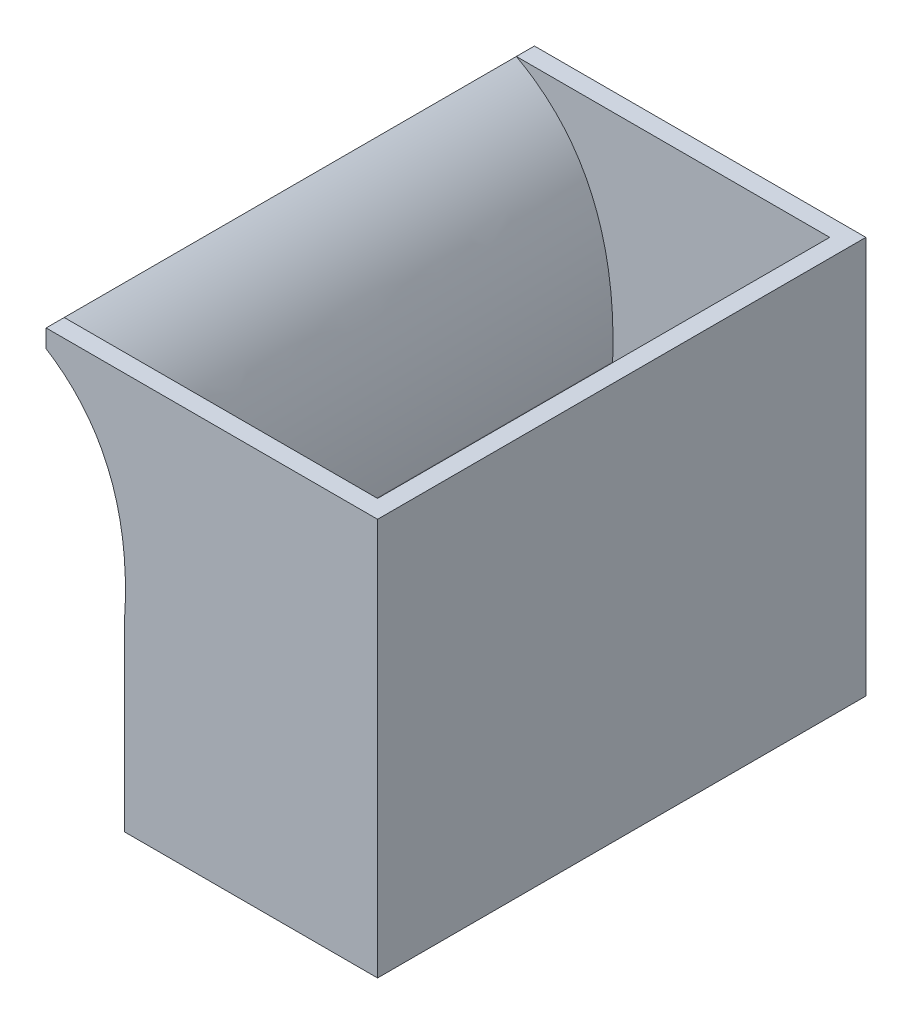
ISO-10303-21;
HEADER;
FILE_DESCRIPTION(('STEP AP214'),'2;1');
FILE_NAME('part.step','',(''),(''),'','','');
FILE_SCHEMA(('AUTOMOTIVE_DESIGN { 1 0 10303 214 1 1 1 1 }'));
ENDSEC;
DATA;
#1=APPLICATION_CONTEXT('core data for automotive mechanical design processes');
#2=APPLICATION_PROTOCOL_DEFINITION('international standard','automotive_design',2000,#1);
#3=PRODUCT_CONTEXT('',#1,'mechanical');
#4=PRODUCT('Part','Part','',(#3));
#5=PRODUCT_RELATED_PRODUCT_CATEGORY('part','',(#4));
#6=PRODUCT_DEFINITION_FORMATION('','',#4);
#7=PRODUCT_DEFINITION_CONTEXT('part definition',#1,'design');
#8=PRODUCT_DEFINITION('design','',#6,#7);
#9=PRODUCT_DEFINITION_SHAPE('','',#8);
#10=(LENGTH_UNIT() NAMED_UNIT(*) SI_UNIT(.MILLI.,.METRE.));
#11=(NAMED_UNIT(*) PLANE_ANGLE_UNIT() SI_UNIT($,.RADIAN.));
#12=(NAMED_UNIT(*) SI_UNIT($,.STERADIAN.) SOLID_ANGLE_UNIT());
#13=UNCERTAINTY_MEASURE_WITH_UNIT(LENGTH_MEASURE(1.E-05),#10,'distance_accuracy_value','');
#14=(GEOMETRIC_REPRESENTATION_CONTEXT(3) GLOBAL_UNCERTAINTY_ASSIGNED_CONTEXT((#13)) GLOBAL_UNIT_ASSIGNED_CONTEXT((#10,
#11,#12)) REPRESENTATION_CONTEXT('',''));
#15=CARTESIAN_POINT('',(0.,0.,0.));
#16=DIRECTION('',(0.,0.,1.));
#17=DIRECTION('',(1.,0.,0.));
#18=AXIS2_PLACEMENT_3D('',#15,#16,#17);
#19=CARTESIAN_POINT('',(-32.9023880536992,0.,660.4));
#20=DIRECTION('',(1.,0.,0.));
#21=DIRECTION('',(0.,0.,-1.));
#22=AXIS2_PLACEMENT_3D('',#19,#20,#21);
#23=PLANE('',#22);
#24=DIRECTION('',(0.,0.,-1.));
#25=VECTOR('',#24,1.);
#26=CARTESIAN_POINT('',(-32.9023880536992,278.528232549587,635.));
#27=LINE('',#26,#25);
#28=CARTESIAN_POINT('',(-32.9023880536992,278.528232549587,660.4));
#29=VERTEX_POINT('',#28);
#30=CARTESIAN_POINT('',(-32.9023880536992,278.528232549587,-25.4000000000001));
#31=VERTEX_POINT('',#30);
#32=EDGE_CURVE('E342',#29,#31,#27,.T.);
#33=ORIENTED_EDGE('',*,*,#32,.F.);
#34=DIRECTION('',(0.,-1.,0.));
#35=VECTOR('',#34,1.);
#36=CARTESIAN_POINT('',(-32.9023880536992,0.,660.4));
#37=LINE('',#36,#35);
#38=CARTESIAN_POINT('',(-32.9023880536992,303.928232549587,660.4));
#39=VERTEX_POINT('',#38);
#40=EDGE_CURVE('E348',#39,#29,#37,.T.);
#41=ORIENTED_EDGE('',*,*,#40,.F.);
#42=DIRECTION('',(0.,0.,-1.));
#43=VECTOR('',#42,1.);
#44=CARTESIAN_POINT('',(-32.9023880536992,303.928232549587,660.4));
#45=LINE('',#44,#43);
#46=CARTESIAN_POINT('',(-32.9023880536992,303.928232549587,635.));
#47=VERTEX_POINT('',#46);
#48=EDGE_CURVE('E327',#39,#47,#45,.T.);
#49=ORIENTED_EDGE('',*,*,#48,.T.);
#50=DIRECTION('',(0.,0.,-1.));
#51=VECTOR('',#50,1.);
#52=CARTESIAN_POINT('',(-32.9023880536992,303.928232549587,635.));
#53=LINE('',#52,#51);
#54=CARTESIAN_POINT('',(-32.9023880536992,303.928232549587,0.));
#55=VERTEX_POINT('',#54);
#56=EDGE_CURVE('E160',#47,#55,#53,.T.);
#57=ORIENTED_EDGE('',*,*,#56,.T.);
#58=DIRECTION('',(0.,0.,1.));
#59=VECTOR('',#58,1.);
#60=CARTESIAN_POINT('',(-32.9023880536992,303.928232549587,-25.4));
#61=LINE('',#60,#59);
#62=CARTESIAN_POINT('',(-32.9023880536992,303.928232549587,-25.4));
#63=VERTEX_POINT('',#62);
#64=EDGE_CURVE('E177',#63,#55,#61,.T.);
#65=ORIENTED_EDGE('',*,*,#64,.F.);
#66=DIRECTION('',(0.,1.,0.));
#67=VECTOR('',#66,1.);
#68=CARTESIAN_POINT('',(-32.9023880536992,303.928232549587,-25.4));
#69=LINE('',#68,#67);
#70=EDGE_CURVE('E233',#31,#63,#69,.T.);
#71=ORIENTED_EDGE('',*,*,#70,.F.);
#72=EDGE_LOOP('',(#33,#41,#49,#57,#65,#71));
#73=FACE_BOUND('',#72,.T.);
#74=ADVANCED_FACE('F41',(#73),#23,.F.);
#75=CARTESIAN_POINT('',(0.,0.,635.));
#76=DIRECTION('',(0.,0.,1.));
#77=DIRECTION('',(1.,0.,0.));
#78=AXIS2_PLACEMENT_3D('',#75,#76,#77);
#79=PLANE('',#78);
#80=CARTESIAN_POINT('',(102.381001745353,0.,635.));
#81=CARTESIAN_POINT('',(111.998180556746,241.329545657183,635.));
#82=CARTESIAN_POINT('',(-53.2276393460096,313.843356669976,635.));
#83=B_SPLINE_CURVE_WITH_KNOTS('',2,(#80,#81,#82),.UNSPECIFIED.,.F.,.F.,(3,3),(0.,1.),.UNSPECIFIED.);
#84=CARTESIAN_POINT('',(102.381001745353,0.,635.));
#85=VERTEX_POINT('',#84);
#86=EDGE_CURVE('E145',#85,#47,#83,.T.);
#87=ORIENTED_EDGE('',*,*,#86,.T.);
#88=DIRECTION('',(-1.,0.,0.));
#89=VECTOR('',#88,1.);
#90=CARTESIAN_POINT('',(432.581001745353,303.928232549587,635.));
#91=LINE('',#90,#89);
#92=CARTESIAN_POINT('',(407.181001745353,303.928232549587,635.));
#93=VERTEX_POINT('',#92);
#94=EDGE_CURVE('E159',#93,#47,#91,.T.);
#95=ORIENTED_EDGE('',*,*,#94,.F.);
#96=DIRECTION('',(0.,1.,0.));
#97=VECTOR('',#96,1.);
#98=CARTESIAN_POINT('',(407.181001745353,0.,635.));
#99=LINE('',#98,#97);
#100=CARTESIAN_POINT('',(407.181001745353,-254.,635.));
#101=VERTEX_POINT('',#100);
#102=EDGE_CURVE('E56',#101,#93,#99,.T.);
#103=ORIENTED_EDGE('',*,*,#102,.F.);
#104=DIRECTION('',(-1.,0.,0.));
#105=VECTOR('',#104,1.);
#106=CARTESIAN_POINT('',(0.,-254.,635.));
#107=LINE('',#106,#105);
#108=CARTESIAN_POINT('',(102.381001745353,-254.,635.));
#109=VERTEX_POINT('',#108);
#110=EDGE_CURVE('E148',#101,#109,#107,.T.);
#111=ORIENTED_EDGE('',*,*,#110,.T.);
#112=DIRECTION('',(0.,1.,0.));
#113=VECTOR('',#112,1.);
#114=CARTESIAN_POINT('',(102.381001745353,-551.942,635.));
#115=LINE('',#114,#113);
#116=EDGE_CURVE('E141',#109,#85,#115,.T.);
#117=ORIENTED_EDGE('',*,*,#116,.T.);
#118=EDGE_LOOP('',(#87,#95,#103,#111,#117));
#119=FACE_BOUND('',#118,.T.);
#120=ADVANCED_FACE('F143',(#119),#79,.F.);
#121=CARTESIAN_POINT('',(432.581001745353,0.,635.));
#122=DIRECTION('',(-1.,0.,0.));
#123=DIRECTION('',(0.,0.,1.));
#124=AXIS2_PLACEMENT_3D('',#121,#122,#123);
#125=PLANE('',#124);
#126=DIRECTION('',(0.,1.,0.));
#127=VECTOR('',#126,1.);
#128=CARTESIAN_POINT('',(432.581001745353,0.,660.4));
#129=LINE('',#128,#127);
#130=CARTESIAN_POINT('',(432.581001745353,-254.,660.4));
#131=VERTEX_POINT('',#130);
#132=CARTESIAN_POINT('',(432.581001745353,303.928232549587,660.4));
#133=VERTEX_POINT('',#132);
#134=EDGE_CURVE('E345',#131,#133,#129,.T.);
#135=ORIENTED_EDGE('',*,*,#134,.F.);
#136=DIRECTION('',(0.,0.,1.));
#137=VECTOR('',#136,1.);
#138=CARTESIAN_POINT('',(432.581001745353,-254.,660.4));
#139=LINE('',#138,#137);
#140=CARTESIAN_POINT('',(432.581001745353,-254.,-25.4));
#141=VERTEX_POINT('',#140);
#142=EDGE_CURVE('E238',#141,#131,#139,.T.);
#143=ORIENTED_EDGE('',*,*,#142,.F.);
#144=DIRECTION('',(0.,-1.,0.));
#145=VECTOR('',#144,1.);
#146=CARTESIAN_POINT('',(432.581001745353,303.928232549587,-25.4));
#147=LINE('',#146,#145);
#148=CARTESIAN_POINT('',(432.581001745353,303.928232549587,-25.4));
#149=VERTEX_POINT('',#148);
#150=EDGE_CURVE('E229',#149,#141,#147,.T.);
#151=ORIENTED_EDGE('',*,*,#150,.F.);
#152=DIRECTION('',(0.,0.,-1.));
#153=VECTOR('',#152,1.);
#154=CARTESIAN_POINT('',(432.581001745353,303.928232549587,635.));
#155=LINE('',#154,#153);
#156=EDGE_CURVE('E215',#133,#149,#155,.T.);
#157=ORIENTED_EDGE('',*,*,#156,.F.);
#158=EDGE_LOOP('',(#135,#143,#151,#157));
#159=FACE_BOUND('',#158,.T.);
#160=ADVANCED_FACE('F43',(#159),#125,.F.);
#161=CARTESIAN_POINT('',(0.,303.928232549587,635.));
#162=DIRECTION('',(0.,1.,0.));
#163=DIRECTION('',(0.,0.,1.));
#164=AXIS2_PLACEMENT_3D('',#161,#162,#163);
#165=PLANE('',#164);
#166=ORIENTED_EDGE('',*,*,#156,.T.);
#167=DIRECTION('',(1.,0.,0.));
#168=VECTOR('',#167,1.);
#169=CARTESIAN_POINT('',(432.581001745353,303.928232549587,-25.4));
#170=LINE('',#169,#168);
#171=EDGE_CURVE('E218',#63,#149,#170,.T.);
#172=ORIENTED_EDGE('',*,*,#171,.F.);
#173=ORIENTED_EDGE('',*,*,#64,.T.);
#174=DIRECTION('',(1.,0.,0.));
#175=VECTOR('',#174,1.);
#176=CARTESIAN_POINT('',(432.581001745353,303.928232549587,0.));
#177=LINE('',#176,#175);
#178=CARTESIAN_POINT('',(407.181001745353,303.928232549587,0.));
#179=VERTEX_POINT('',#178);
#180=EDGE_CURVE('E239',#55,#179,#177,.T.);
#181=ORIENTED_EDGE('',*,*,#180,.T.);
#182=DIRECTION('',(0.,0.,-1.));
#183=VECTOR('',#182,1.);
#184=CARTESIAN_POINT('',(407.181001745353,303.928232549587,635.));
#185=LINE('',#184,#183);
#186=EDGE_CURVE('E224',#93,#179,#185,.T.);
#187=ORIENTED_EDGE('',*,*,#186,.F.);
#188=ORIENTED_EDGE('',*,*,#94,.T.);
#189=ORIENTED_EDGE('',*,*,#48,.F.);
#190=DIRECTION('',(-1.,0.,0.));
#191=VECTOR('',#190,1.);
#192=CARTESIAN_POINT('',(432.581001745353,303.928232549587,660.4));
#193=LINE('',#192,#191);
#194=EDGE_CURVE('E220',#133,#39,#193,.T.);
#195=ORIENTED_EDGE('',*,*,#194,.F.);
#196=EDGE_LOOP('',(#166,#172,#173,#181,#187,#188,#189,#195));
#197=FACE_BOUND('',#196,.T.);
#198=ADVANCED_FACE('F205',(#197),#165,.T.);
#199=CARTESIAN_POINT('',(407.181001745353,0.,635.));
#200=DIRECTION('',(-1.,0.,0.));
#201=DIRECTION('',(0.,0.,1.));
#202=AXIS2_PLACEMENT_3D('',#199,#200,#201);
#203=PLANE('',#202);
#204=DIRECTION('',(0.,1.,0.));
#205=VECTOR('',#204,1.);
#206=CARTESIAN_POINT('',(407.181001745353,0.,0.));
#207=LINE('',#206,#205);
#208=CARTESIAN_POINT('',(407.181001745353,-254.,0.));
#209=VERTEX_POINT('',#208);
#210=EDGE_CURVE('E324',#209,#179,#207,.T.);
#211=ORIENTED_EDGE('',*,*,#210,.F.);
#212=DIRECTION('',(0.,0.,1.));
#213=VECTOR('',#212,1.);
#214=CARTESIAN_POINT('',(407.181001745353,-254.,0.));
#215=LINE('',#214,#213);
#216=EDGE_CURVE('E364',#209,#101,#215,.T.);
#217=ORIENTED_EDGE('',*,*,#216,.T.);
#218=ORIENTED_EDGE('',*,*,#102,.T.);
#219=ORIENTED_EDGE('',*,*,#186,.T.);
#220=EDGE_LOOP('',(#211,#217,#218,#219));
#221=FACE_BOUND('',#220,.T.);
#222=ADVANCED_FACE('F196',(#221),#203,.T.);
#223=CARTESIAN_POINT('',(0.,0.,660.4));
#224=DIRECTION('',(0.,0.,1.));
#225=DIRECTION('',(1.,0.,0.));
#226=AXIS2_PLACEMENT_3D('',#223,#224,#225);
#227=PLANE('',#226);
#228=CARTESIAN_POINT('',(76.9810017453533,0.,660.4));
#229=CARTESIAN_POINT('',(93.0815099328659,219.107694502498,660.4));
#230=CARTESIAN_POINT('',(-57.2058785240017,291.939410940714,660.4));
#231=B_SPLINE_CURVE_WITH_KNOTS('',2,(#228,#229,#230),.UNSPECIFIED.,.F.,.F.,(3,3),(0.,1.),.UNSPECIFIED.);
#232=CARTESIAN_POINT('',(76.9810017453533,0.,660.4));
#233=VERTEX_POINT('',#232);
#234=CARTESIAN_POINT('',(-21.0527351089498,270.609311274524,660.4));
#235=VERTEX_POINT('',#234);
#236=EDGE_CURVE('E243',#233,#235,#231,.T.);
#237=ORIENTED_EDGE('',*,*,#236,.F.);
#238=DIRECTION('',(0.,1.,0.));
#239=VECTOR('',#238,1.);
#240=CARTESIAN_POINT('',(76.9810017453533,-254.,660.4));
#241=LINE('',#240,#239);
#242=CARTESIAN_POINT('',(76.9810017453533,-254.,660.4));
#243=VERTEX_POINT('',#242);
#244=EDGE_CURVE('E377',#243,#233,#241,.T.);
#245=ORIENTED_EDGE('',*,*,#244,.F.);
#246=DIRECTION('',(-1.,0.,0.));
#247=VECTOR('',#246,1.);
#248=CARTESIAN_POINT('',(76.9810017453533,-254.,660.4));
#249=LINE('',#248,#247);
#250=EDGE_CURVE('E376',#131,#243,#249,.T.);
#251=ORIENTED_EDGE('',*,*,#250,.F.);
#252=ORIENTED_EDGE('',*,*,#134,.T.);
#253=ORIENTED_EDGE('',*,*,#194,.T.);
#254=ORIENTED_EDGE('',*,*,#40,.T.);
#255=CARTESIAN_POINT('',(-32.9023880536992,278.528232549587,660.4));
#256=CARTESIAN_POINT('',(100.442231156546,194.322430840864,660.4));
#257=CARTESIAN_POINT('',(76.9810017453533,0.,660.4));
#258=B_SPLINE_CURVE_WITH_KNOTS('',2,(#255,#256,#257),.UNSPECIFIED.,.F.,.F.,(3,3),(0.,1.),.UNSPECIFIED.);
#259=EDGE_CURVE('E264',#29,#235,#258,.T.);
#260=ORIENTED_EDGE('',*,*,#259,.T.);
#261=EDGE_LOOP('',(#237,#245,#251,#252,#253,#254,#260));
#262=FACE_BOUND('',#261,.T.);
#263=ADVANCED_FACE('F193',(#262),#227,.T.);
#264=CARTESIAN_POINT('',(76.9810017453533,0.,635.));
#265=CARTESIAN_POINT('',(100.442231156546,194.322430840864,635.));
#266=CARTESIAN_POINT('',(-32.9023880536992,278.528232549587,635.));
#267=B_SPLINE_CURVE_WITH_KNOTS('',2,(#264,#265,#266),.UNSPECIFIED.,.F.,.F.,(3,3),(0.,1.),.UNSPECIFIED.);
#268=CARTESIAN_POINT('',(76.9810017453533,0.,635.));
#269=VERTEX_POINT('',#268);
#270=CARTESIAN_POINT('',(-21.0527351089498,270.609311274524,635.));
#271=VERTEX_POINT('',#270);
#272=EDGE_CURVE('E164',#269,#271,#267,.T.);
#273=ORIENTED_EDGE('',*,*,#272,.F.);
#274=CARTESIAN_POINT('',(76.9810017453533,0.,635.));
#275=CARTESIAN_POINT('',(93.0815099328659,219.107694502498,635.));
#276=CARTESIAN_POINT('',(-57.2058785240017,291.939410940714,635.));
#277=B_SPLINE_CURVE_WITH_KNOTS('',2,(#274,#275,#276),.UNSPECIFIED.,.F.,.F.,(3,3),(0.,1.),.UNSPECIFIED.);
#278=EDGE_CURVE('E248',#269,#271,#277,.T.);
#279=ORIENTED_EDGE('',*,*,#278,.T.);
#280=EDGE_LOOP('',(#273,#279));
#281=FACE_BOUND('',#280,.T.);
#282=ADVANCED_FACE('F191',(#281),#79,.F.);
#283=DIRECTION('',(0.,0.,-1.));
#284=VECTOR('',#283,1.);
#285=SURFACE_OF_LINEAR_EXTRUSION('',#83,#284);
#286=CARTESIAN_POINT('',(102.381001745353,0.,0.));
#287=CARTESIAN_POINT('',(111.998180556746,241.329545657183,0.));
#288=CARTESIAN_POINT('',(-53.2276393460096,313.843356669976,0.));
#289=B_SPLINE_CURVE_WITH_KNOTS('',2,(#286,#287,#288),.UNSPECIFIED.,.F.,.F.,(3,3),(0.,1.),.UNSPECIFIED.);
#290=CARTESIAN_POINT('',(102.381001745353,0.,0.));
#291=VERTEX_POINT('',#290);
#292=EDGE_CURVE('E171',#291,#55,#289,.T.);
#293=ORIENTED_EDGE('',*,*,#292,.T.);
#294=ORIENTED_EDGE('',*,*,#56,.F.);
#295=ORIENTED_EDGE('',*,*,#86,.F.);
#296=DIRECTION('',(0.,0.,-1.));
#297=VECTOR('',#296,1.);
#298=CARTESIAN_POINT('',(102.381001745353,0.,635.));
#299=LINE('',#298,#297);
#300=EDGE_CURVE('E154',#85,#291,#299,.T.);
#301=ORIENTED_EDGE('',*,*,#300,.T.);
#302=EDGE_LOOP('',(#293,#294,#295,#301));
#303=FACE_BOUND('',#302,.T.);
#304=ADVANCED_FACE('F162',(#303),#285,.F.);
#305=DIRECTION('',(0.,0.,-1.));
#306=VECTOR('',#305,1.);
#307=SURFACE_OF_LINEAR_EXTRUSION('',#267,#306);
#308=ORIENTED_EDGE('',*,*,#272,.T.);
#309=DIRECTION('',(0.,0.,1.));
#310=VECTOR('',#309,1.);
#311=CARTESIAN_POINT('',(-21.0527351089498,270.609311274524,-1745.234));
#312=LINE('',#311,#310);
#313=EDGE_CURVE('E286',#271,#235,#312,.T.);
#314=ORIENTED_EDGE('',*,*,#313,.T.);
#315=ORIENTED_EDGE('',*,*,#259,.F.);
#316=ORIENTED_EDGE('',*,*,#32,.T.);
#317=CARTESIAN_POINT('',(-32.9023880536992,278.528232549587,-25.4000000000001));
#318=CARTESIAN_POINT('',(100.442231156546,194.322430840864,-25.4000000000001));
#319=CARTESIAN_POINT('',(76.9810017453533,0.,-25.4000000000001));
#320=B_SPLINE_CURVE_WITH_KNOTS('',2,(#317,#318,#319),.UNSPECIFIED.,.F.,.F.,(3,3),(0.,1.),.UNSPECIFIED.);
#321=CARTESIAN_POINT('',(-21.0527351089498,270.609311274524,-25.4000000000001));
#322=VERTEX_POINT('',#321);
#323=EDGE_CURVE('E272',#322,#31,#320,.F.);
#324=ORIENTED_EDGE('',*,*,#323,.F.);
#325=CARTESIAN_POINT('',(-21.0527351089498,270.609311274524,0.));
#326=VERTEX_POINT('',#325);
#327=EDGE_CURVE('E64',#322,#326,#312,.T.);
#328=ORIENTED_EDGE('',*,*,#327,.T.);
#329=CARTESIAN_POINT('',(76.9810017453533,0.,0.));
#330=CARTESIAN_POINT('',(100.442231156546,194.322430840864,0.));
#331=CARTESIAN_POINT('',(-32.9023880536992,278.528232549587,0.));
#332=B_SPLINE_CURVE_WITH_KNOTS('',2,(#329,#330,#331),.UNSPECIFIED.,.F.,.F.,(3,3),(0.,1.),.UNSPECIFIED.);
#333=CARTESIAN_POINT('',(76.9810017453533,0.,0.));
#334=VERTEX_POINT('',#333);
#335=EDGE_CURVE('E165',#334,#326,#332,.T.);
#336=ORIENTED_EDGE('',*,*,#335,.F.);
#337=DIRECTION('',(0.,0.,-1.));
#338=VECTOR('',#337,1.);
#339=CARTESIAN_POINT('',(76.9810017453533,0.,635.));
#340=LINE('',#339,#338);
#341=EDGE_CURVE('E168',#269,#334,#340,.T.);
#342=ORIENTED_EDGE('',*,*,#341,.F.);
#343=EDGE_LOOP('',(#308,#314,#315,#316,#324,#328,#336,#342));
#344=FACE_BOUND('',#343,.T.);
#345=ADVANCED_FACE('F190',(#344),#307,.T.);
#346=CARTESIAN_POINT('',(0.,0.,0.));
#347=DIRECTION('',(0.,0.,-1.));
#348=DIRECTION('',(-1.,0.,0.));
#349=AXIS2_PLACEMENT_3D('',#346,#347,#348);
#350=PLANE('',#349);
#351=ORIENTED_EDGE('',*,*,#210,.T.);
#352=ORIENTED_EDGE('',*,*,#180,.F.);
#353=ORIENTED_EDGE('',*,*,#292,.F.);
#354=DIRECTION('',(0.,1.,0.));
#355=VECTOR('',#354,1.);
#356=CARTESIAN_POINT('',(102.381001745353,-551.942,0.));
#357=LINE('',#356,#355);
#358=CARTESIAN_POINT('',(102.381001745353,-254.,0.));
#359=VERTEX_POINT('',#358);
#360=EDGE_CURVE('E151',#359,#291,#357,.T.);
#361=ORIENTED_EDGE('',*,*,#360,.F.);
#362=DIRECTION('',(1.,0.,0.));
#363=VECTOR('',#362,1.);
#364=CARTESIAN_POINT('',(0.,-254.,0.));
#365=LINE('',#364,#363);
#366=EDGE_CURVE('E49',#359,#209,#365,.T.);
#367=ORIENTED_EDGE('',*,*,#366,.T.);
#368=EDGE_LOOP('',(#351,#352,#353,#361,#367));
#369=FACE_BOUND('',#368,.T.);
#370=ADVANCED_FACE('F309',(#369),#350,.F.);
#371=CARTESIAN_POINT('',(0.,0.,-25.4));
#372=DIRECTION('',(0.,0.,-1.));
#373=DIRECTION('',(-1.,0.,0.));
#374=AXIS2_PLACEMENT_3D('',#371,#372,#373);
#375=PLANE('',#374);
#376=CARTESIAN_POINT('',(76.9810017453533,0.,-25.4000000000001));
#377=CARTESIAN_POINT('',(93.0815099328659,219.107694502498,-25.4000000000001));
#378=CARTESIAN_POINT('',(-57.2058785240017,291.939410940714,-25.4000000000001));
#379=B_SPLINE_CURVE_WITH_KNOTS('',2,(#376,#377,#378),.UNSPECIFIED.,.F.,.F.,(3,3),(0.,1.),.UNSPECIFIED.);
#380=CARTESIAN_POINT('',(76.9810017453533,0.,-25.4));
#381=VERTEX_POINT('',#380);
#382=EDGE_CURVE('E256',#322,#381,#379,.F.);
#383=ORIENTED_EDGE('',*,*,#382,.F.);
#384=ORIENTED_EDGE('',*,*,#323,.T.);
#385=ORIENTED_EDGE('',*,*,#70,.T.);
#386=ORIENTED_EDGE('',*,*,#171,.T.);
#387=ORIENTED_EDGE('',*,*,#150,.T.);
#388=DIRECTION('',(1.,0.,0.));
#389=VECTOR('',#388,1.);
#390=CARTESIAN_POINT('',(76.9810017453533,-254.,-25.4));
#391=LINE('',#390,#389);
#392=CARTESIAN_POINT('',(76.9810017453533,-254.,-25.4));
#393=VERTEX_POINT('',#392);
#394=EDGE_CURVE('E371',#393,#141,#391,.T.);
#395=ORIENTED_EDGE('',*,*,#394,.F.);
#396=DIRECTION('',(0.,1.,0.));
#397=VECTOR('',#396,1.);
#398=CARTESIAN_POINT('',(76.9810017453533,-254.,-25.4));
#399=LINE('',#398,#397);
#400=EDGE_CURVE('E289',#393,#381,#399,.T.);
#401=ORIENTED_EDGE('',*,*,#400,.T.);
#402=EDGE_LOOP('',(#383,#384,#385,#386,#387,#395,#401));
#403=FACE_BOUND('',#402,.T.);
#404=ADVANCED_FACE('F228',(#403),#375,.T.);
#405=ORIENTED_EDGE('',*,*,#335,.T.);
#406=CARTESIAN_POINT('',(76.9810017453533,0.,0.));
#407=CARTESIAN_POINT('',(93.0815099328659,219.107694502498,0.));
#408=CARTESIAN_POINT('',(-57.2058785240017,291.939410940714,0.));
#409=B_SPLINE_CURVE_WITH_KNOTS('',2,(#406,#407,#408),.UNSPECIFIED.,.F.,.F.,(3,3),(0.,1.),.UNSPECIFIED.);
#410=EDGE_CURVE('E223',#326,#334,#409,.F.);
#411=ORIENTED_EDGE('',*,*,#410,.T.);
#412=EDGE_LOOP('',(#405,#411));
#413=FACE_BOUND('',#412,.T.);
#414=ADVANCED_FACE('F308',(#413),#350,.F.);
#415=CARTESIAN_POINT('',(76.9810017453533,0.,-1745.234));
#416=CARTESIAN_POINT('',(93.0815099328659,219.107694502498,-1745.234));
#417=CARTESIAN_POINT('',(-57.2058785240017,291.939410940714,-1745.234));
#418=B_SPLINE_CURVE_WITH_KNOTS('',2,(#415,#416,#417),.UNSPECIFIED.,.F.,.F.,(3,3),(0.,1.),.UNSPECIFIED.);
#419=DIRECTION('',(0.,0.,1.));
#420=VECTOR('',#419,1.);
#421=SURFACE_OF_LINEAR_EXTRUSION('',#418,#420);
#422=ORIENTED_EDGE('',*,*,#382,.T.);
#423=DIRECTION('',(0.,0.,1.));
#424=VECTOR('',#423,1.);
#425=CARTESIAN_POINT('',(76.9810017453533,0.,-1745.234));
#426=LINE('',#425,#424);
#427=EDGE_CURVE('E279',#381,#334,#426,.T.);
#428=ORIENTED_EDGE('',*,*,#427,.T.);
#429=ORIENTED_EDGE('',*,*,#410,.F.);
#430=ORIENTED_EDGE('',*,*,#327,.F.);
#431=EDGE_LOOP('',(#422,#428,#429,#430));
#432=FACE_BOUND('',#431,.T.);
#433=ADVANCED_FACE('F304',(#432),#421,.F.);
#434=ORIENTED_EDGE('',*,*,#236,.T.);
#435=ORIENTED_EDGE('',*,*,#313,.F.);
#436=ORIENTED_EDGE('',*,*,#278,.F.);
#437=EDGE_CURVE('E280',#269,#233,#426,.T.);
#438=ORIENTED_EDGE('',*,*,#437,.T.);
#439=EDGE_LOOP('',(#434,#435,#436,#438));
#440=FACE_BOUND('',#439,.T.);
#441=ADVANCED_FACE('F299',(#440),#421,.F.);
#442=CARTESIAN_POINT('',(76.9810017453533,-254.,660.4));
#443=DIRECTION('',(1.,0.,0.));
#444=DIRECTION('',(0.,0.,-1.));
#445=AXIS2_PLACEMENT_3D('',#442,#443,#444);
#446=PLANE('',#445);
#447=ORIENTED_EDGE('',*,*,#437,.F.);
#448=ORIENTED_EDGE('',*,*,#341,.T.);
#449=ORIENTED_EDGE('',*,*,#427,.F.);
#450=ORIENTED_EDGE('',*,*,#400,.F.);
#451=DIRECTION('',(0.,0.,-1.));
#452=VECTOR('',#451,1.);
#453=CARTESIAN_POINT('',(76.9810017453533,-254.,660.4));
#454=LINE('',#453,#452);
#455=EDGE_CURVE('E368',#243,#393,#454,.T.);
#456=ORIENTED_EDGE('',*,*,#455,.F.);
#457=ORIENTED_EDGE('',*,*,#244,.T.);
#458=EDGE_LOOP('',(#447,#448,#449,#450,#456,#457));
#459=FACE_BOUND('',#458,.T.);
#460=ADVANCED_FACE('F303',(#459),#446,.F.);
#461=CARTESIAN_POINT('',(0.,-254.,0.));
#462=DIRECTION('',(0.,-1.,0.));
#463=DIRECTION('',(0.,0.,-1.));
#464=AXIS2_PLACEMENT_3D('',#461,#462,#463);
#465=PLANE('',#464);
#466=DIRECTION('',(0.,0.,-1.));
#467=VECTOR('',#466,1.);
#468=CARTESIAN_POINT('',(102.381001745353,-254.,0.));
#469=LINE('',#468,#467);
#470=EDGE_CURVE('E12',#109,#359,#469,.T.);
#471=ORIENTED_EDGE('',*,*,#470,.F.);
#472=ORIENTED_EDGE('',*,*,#110,.F.);
#473=ORIENTED_EDGE('',*,*,#216,.F.);
#474=ORIENTED_EDGE('',*,*,#366,.F.);
#475=EDGE_LOOP('',(#471,#472,#473,#474));
#476=FACE_BOUND('',#475,.T.);
#477=ORIENTED_EDGE('',*,*,#455,.T.);
#478=ORIENTED_EDGE('',*,*,#394,.T.);
#479=ORIENTED_EDGE('',*,*,#142,.T.);
#480=ORIENTED_EDGE('',*,*,#250,.T.);
#481=EDGE_LOOP('',(#477,#478,#479,#480));
#482=FACE_BOUND('',#481,.T.);
#483=ADVANCED_FACE('F366',(#476,#482),#465,.T.);
#484=CARTESIAN_POINT('',(102.381001745353,-551.942,635.));
#485=DIRECTION('',(-1.,0.,0.));
#486=DIRECTION('',(0.,0.,1.));
#487=AXIS2_PLACEMENT_3D('',#484,#485,#486);
#488=PLANE('',#487);
#489=ORIENTED_EDGE('',*,*,#470,.T.);
#490=ORIENTED_EDGE('',*,*,#360,.T.);
#491=ORIENTED_EDGE('',*,*,#300,.F.);
#492=ORIENTED_EDGE('',*,*,#116,.F.);
#493=EDGE_LOOP('',(#489,#490,#491,#492));
#494=FACE_BOUND('',#493,.T.);
#495=ADVANCED_FACE('F155',(#494),#488,.F.);
#496=CLOSED_SHELL('',(#74,#120,#160,#198,#222,#263,#282,#304,#345,#370,#404,#414,#433,#441,#460,
#483,#495));
#497=MANIFOLD_SOLID_BREP('B2',#496);
#498=ADVANCED_BREP_SHAPE_REPRESENTATION('',(#18,#497),#14);
#499=SHAPE_DEFINITION_REPRESENTATION(#9,#498);
ENDSEC;
END-ISO-10303-21;
